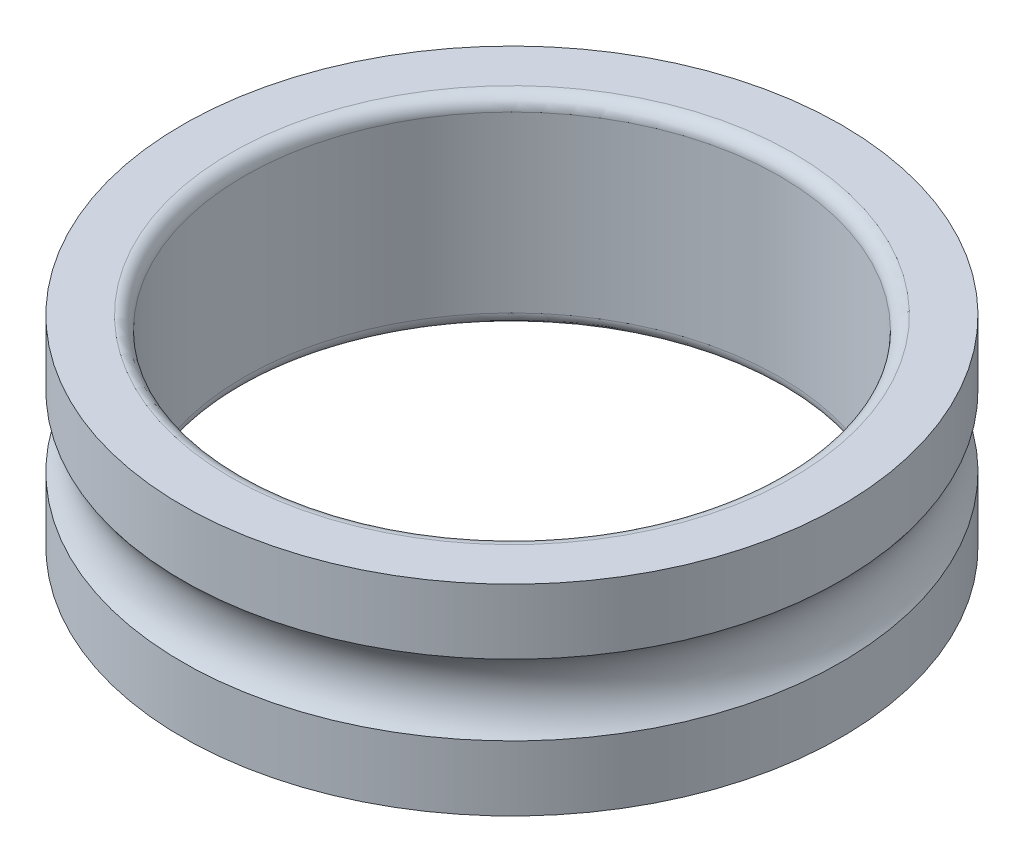
ISO-10303-21;
HEADER;
FILE_DESCRIPTION(('STEP AP214'),'2;1');
FILE_NAME('part.step','',(''),(''),'','','');
FILE_SCHEMA(('AUTOMOTIVE_DESIGN { 1 0 10303 214 1 1 1 1 }'));
ENDSEC;
DATA;
#1=APPLICATION_CONTEXT('core data for automotive mechanical design processes');
#2=APPLICATION_PROTOCOL_DEFINITION('international standard','automotive_design',2000,#1);
#3=PRODUCT_CONTEXT('',#1,'mechanical');
#4=PRODUCT('Part','Part','',(#3));
#5=PRODUCT_RELATED_PRODUCT_CATEGORY('part','',(#4));
#6=PRODUCT_DEFINITION_FORMATION('','',#4);
#7=PRODUCT_DEFINITION_CONTEXT('part definition',#1,'design');
#8=PRODUCT_DEFINITION('design','',#6,#7);
#9=PRODUCT_DEFINITION_SHAPE('','',#8);
#10=(LENGTH_UNIT() NAMED_UNIT(*) SI_UNIT(.MILLI.,.METRE.));
#11=(NAMED_UNIT(*) PLANE_ANGLE_UNIT() SI_UNIT($,.RADIAN.));
#12=(NAMED_UNIT(*) SI_UNIT($,.STERADIAN.) SOLID_ANGLE_UNIT());
#13=UNCERTAINTY_MEASURE_WITH_UNIT(LENGTH_MEASURE(1.E-05),#10,'distance_accuracy_value','');
#14=(GEOMETRIC_REPRESENTATION_CONTEXT(3) GLOBAL_UNCERTAINTY_ASSIGNED_CONTEXT((#13)) GLOBAL_UNIT_ASSIGNED_CONTEXT((#10,
#11,#12)) REPRESENTATION_CONTEXT('',''));
#15=CARTESIAN_POINT('',(0.,0.,0.));
#16=DIRECTION('',(0.,0.,1.));
#17=DIRECTION('',(1.,0.,0.));
#18=AXIS2_PLACEMENT_3D('',#15,#16,#17);
#19=CARTESIAN_POINT('',(0.,7.5,0.));
#20=DIRECTION('',(0.,-1.,0.));
#21=DIRECTION('',(0.,0.,-1.));
#22=AXIS2_PLACEMENT_3D('',#19,#20,#21);
#23=TOROIDAL_SURFACE('',#22,27.5875,3.96875);
#24=CARTESIAN_POINT('',(0.,10.1409411792957,0.));
#25=DIRECTION('',(0.,-1.,0.));
#26=DIRECTION('',(0.,0.,-1.));
#27=AXIS2_PLACEMENT_3D('',#24,#25,#26);
#28=CIRCLE('',#27,24.625);
#29=CARTESIAN_POINT('',(0.,10.1409411792957,-24.625));
#30=VERTEX_POINT('',#29);
#31=EDGE_CURVE('E63',#30,#30,#28,.T.);
#32=ORIENTED_EDGE('',*,*,#31,.T.);
#33=EDGE_LOOP('',(#32));
#34=FACE_BOUND('',#33,.T.);
#35=CARTESIAN_POINT('',(0.,4.85905882070425,0.));
#36=DIRECTION('',(0.,-1.,0.));
#37=DIRECTION('',(0.,0.,-1.));
#38=AXIS2_PLACEMENT_3D('',#35,#36,#37);
#39=CIRCLE('',#38,24.625);
#40=CARTESIAN_POINT('',(0.,4.85905882070425,-24.625));
#41=VERTEX_POINT('',#40);
#42=EDGE_CURVE('E54',#41,#41,#39,.T.);
#43=ORIENTED_EDGE('',*,*,#42,.F.);
#44=EDGE_LOOP('',(#43));
#45=FACE_BOUND('',#44,.T.);
#46=ADVANCED_FACE('F34',(#34,#45),#23,.F.);
#47=CARTESIAN_POINT('',(0.,0.,0.));
#48=DIRECTION('',(0.,-1.,0.));
#49=DIRECTION('',(0.,0.,-1.));
#50=AXIS2_PLACEMENT_3D('',#47,#48,#49);
#51=CYLINDRICAL_SURFACE('',#50,24.625);
#52=ORIENTED_EDGE('',*,*,#42,.T.);
#53=EDGE_LOOP('',(#52));
#54=FACE_BOUND('',#53,.T.);
#55=CARTESIAN_POINT('',(0.,0.,0.));
#56=DIRECTION('',(0.,-1.,0.));
#57=DIRECTION('',(0.,0.,-1.));
#58=AXIS2_PLACEMENT_3D('',#55,#56,#57);
#59=CIRCLE('',#58,24.625);
#60=CARTESIAN_POINT('',(0.,0.,-24.625));
#61=VERTEX_POINT('',#60);
#62=EDGE_CURVE('E57',#61,#61,#59,.T.);
#63=ORIENTED_EDGE('',*,*,#62,.F.);
#64=EDGE_LOOP('',(#63));
#65=FACE_BOUND('',#64,.T.);
#66=ADVANCED_FACE('F75',(#54,#65),#51,.T.);
#67=CARTESIAN_POINT('',(0.,0.,0.));
#68=DIRECTION('',(0.,1.,0.));
#69=DIRECTION('',(0.,0.,1.));
#70=AXIS2_PLACEMENT_3D('',#67,#68,#69);
#71=PLANE('',#70);
#72=CARTESIAN_POINT('',(0.,0.,0.));
#73=DIRECTION('',(0.,1.,0.));
#74=DIRECTION('',(0.,0.,1.));
#75=AXIS2_PLACEMENT_3D('',#72,#73,#74);
#76=CIRCLE('',#75,21.);
#77=CARTESIAN_POINT('',(0.,0.,21.));
#78=VERTEX_POINT('',#77);
#79=EDGE_CURVE('E41',#78,#78,#76,.T.);
#80=ORIENTED_EDGE('',*,*,#79,.T.);
#81=EDGE_LOOP('',(#80));
#82=FACE_BOUND('',#81,.T.);
#83=ORIENTED_EDGE('',*,*,#62,.T.);
#84=EDGE_LOOP('',(#83));
#85=FACE_BOUND('',#84,.T.);
#86=ADVANCED_FACE('F84',(#82,#85),#71,.F.);
#87=CARTESIAN_POINT('',(0.,0.,0.));
#88=DIRECTION('',(0.,-1.,0.));
#89=DIRECTION('',(0.,0.,-1.));
#90=AXIS2_PLACEMENT_3D('',#87,#88,#89);
#91=CYLINDRICAL_SURFACE('',#90,20.);
#92=CARTESIAN_POINT('',(0.,1.,0.));
#93=DIRECTION('',(0.,1.,0.));
#94=DIRECTION('',(0.,0.,1.));
#95=AXIS2_PLACEMENT_3D('',#92,#93,#94);
#96=CIRCLE('',#95,20.);
#97=CARTESIAN_POINT('',(0.,1.,20.));
#98=VERTEX_POINT('',#97);
#99=EDGE_CURVE('E45',#98,#98,#96,.F.);
#100=ORIENTED_EDGE('',*,*,#99,.T.);
#101=EDGE_LOOP('',(#100));
#102=FACE_BOUND('',#101,.T.);
#103=CARTESIAN_POINT('',(0.,14.,0.));
#104=DIRECTION('',(0.,1.,0.));
#105=DIRECTION('',(0.,0.,1.));
#106=AXIS2_PLACEMENT_3D('',#103,#104,#105);
#107=CIRCLE('',#106,20.);
#108=CARTESIAN_POINT('',(0.,14.,20.));
#109=VERTEX_POINT('',#108);
#110=EDGE_CURVE('E49',#109,#109,#107,.T.);
#111=ORIENTED_EDGE('',*,*,#110,.T.);
#112=EDGE_LOOP('',(#111));
#113=FACE_BOUND('',#112,.T.);
#114=ADVANCED_FACE('F81',(#102,#113),#91,.F.);
#115=CARTESIAN_POINT('',(0.,15.,0.));
#116=DIRECTION('',(0.,1.,0.));
#117=DIRECTION('',(0.,0.,1.));
#118=AXIS2_PLACEMENT_3D('',#115,#116,#117);
#119=PLANE('',#118);
#120=CARTESIAN_POINT('',(0.,15.,0.));
#121=DIRECTION('',(0.,1.,0.));
#122=DIRECTION('',(0.,0.,1.));
#123=AXIS2_PLACEMENT_3D('',#120,#121,#122);
#124=CIRCLE('',#123,21.);
#125=CARTESIAN_POINT('',(0.,15.,21.));
#126=VERTEX_POINT('',#125);
#127=EDGE_CURVE('E10',#126,#126,#124,.F.);
#128=ORIENTED_EDGE('',*,*,#127,.T.);
#129=EDGE_LOOP('',(#128));
#130=FACE_BOUND('',#129,.T.);
#131=CARTESIAN_POINT('',(0.,15.,0.));
#132=DIRECTION('',(0.,-1.,0.));
#133=DIRECTION('',(0.,0.,-1.));
#134=AXIS2_PLACEMENT_3D('',#131,#132,#133);
#135=CIRCLE('',#134,24.625);
#136=CARTESIAN_POINT('',(0.,15.,-24.625));
#137=VERTEX_POINT('',#136);
#138=EDGE_CURVE('E60',#137,#137,#135,.T.);
#139=ORIENTED_EDGE('',*,*,#138,.F.);
#140=EDGE_LOOP('',(#139));
#141=FACE_BOUND('',#140,.T.);
#142=ADVANCED_FACE('F72',(#130,#141),#119,.T.);
#143=ORIENTED_EDGE('',*,*,#138,.T.);
#144=EDGE_LOOP('',(#143));
#145=FACE_BOUND('',#144,.T.);
#146=ORIENTED_EDGE('',*,*,#31,.F.);
#147=EDGE_LOOP('',(#146));
#148=FACE_BOUND('',#147,.T.);
#149=ADVANCED_FACE('F69',(#145,#148),#51,.T.);
#150=CARTESIAN_POINT('',(0.,1.,0.));
#151=DIRECTION('',(0.,1.,0.));
#152=DIRECTION('',(0.,0.,1.));
#153=AXIS2_PLACEMENT_3D('',#150,#151,#152);
#154=TOROIDAL_SURFACE('',#153,21.,1.);
#155=ORIENTED_EDGE('',*,*,#79,.F.);
#156=EDGE_LOOP('',(#155));
#157=FACE_BOUND('',#156,.T.);
#158=ORIENTED_EDGE('',*,*,#99,.F.);
#159=EDGE_LOOP('',(#158));
#160=FACE_BOUND('',#159,.T.);
#161=ADVANCED_FACE('F71',(#157,#160),#154,.T.);
#162=CARTESIAN_POINT('',(0.,14.,0.));
#163=DIRECTION('',(0.,1.,0.));
#164=DIRECTION('',(0.,0.,1.));
#165=AXIS2_PLACEMENT_3D('',#162,#163,#164);
#166=TOROIDAL_SURFACE('',#165,21.,1.);
#167=ORIENTED_EDGE('',*,*,#110,.F.);
#168=EDGE_LOOP('',(#167));
#169=FACE_BOUND('',#168,.T.);
#170=ORIENTED_EDGE('',*,*,#127,.F.);
#171=EDGE_LOOP('',(#170));
#172=FACE_BOUND('',#171,.T.);
#173=ADVANCED_FACE('F36',(#169,#172),#166,.T.);
#174=CLOSED_SHELL('',(#46,#66,#86,#114,#142,#149,#161,#173));
#175=MANIFOLD_SOLID_BREP('B2',#174);
#176=ADVANCED_BREP_SHAPE_REPRESENTATION('',(#18,#175),#14);
#177=SHAPE_DEFINITION_REPRESENTATION(#9,#176);
ENDSEC;
END-ISO-10303-21;
